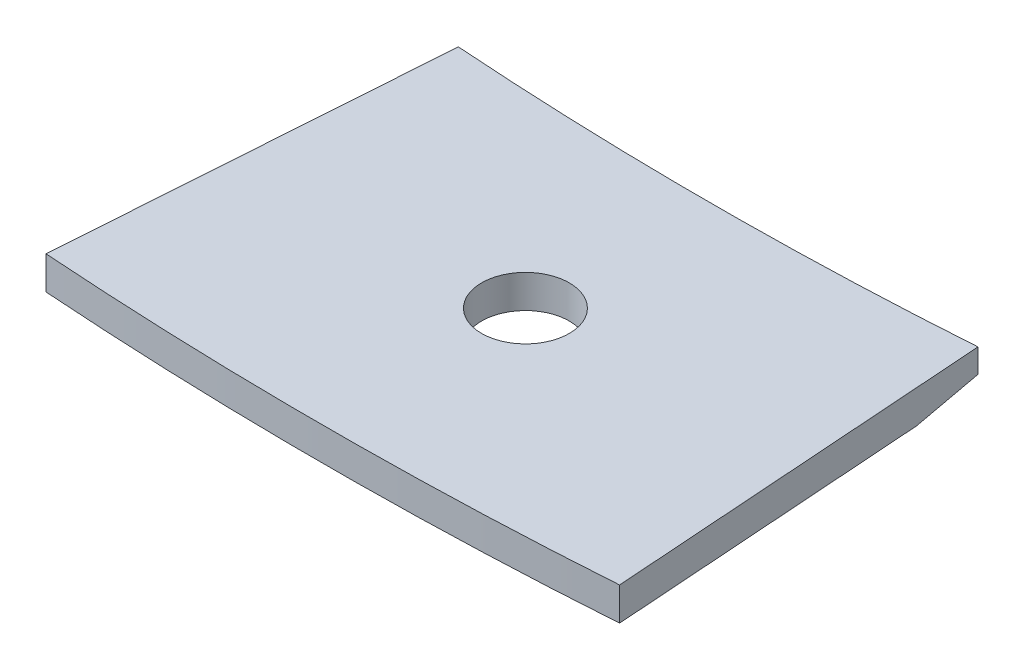
ISO-10303-21;
HEADER;
FILE_DESCRIPTION(('STEP AP214'),'2;1');
FILE_NAME('part.step','',(''),(''),'','','');
FILE_SCHEMA(('AUTOMOTIVE_DESIGN { 1 0 10303 214 1 1 1 1 }'));
ENDSEC;
DATA;
#1=APPLICATION_CONTEXT('core data for automotive mechanical design processes');
#2=APPLICATION_PROTOCOL_DEFINITION('international standard','automotive_design',2000,#1);
#3=PRODUCT_CONTEXT('',#1,'mechanical');
#4=PRODUCT('Part','Part','',(#3));
#5=PRODUCT_RELATED_PRODUCT_CATEGORY('part','',(#4));
#6=PRODUCT_DEFINITION_FORMATION('','',#4);
#7=PRODUCT_DEFINITION_CONTEXT('part definition',#1,'design');
#8=PRODUCT_DEFINITION('design','',#6,#7);
#9=PRODUCT_DEFINITION_SHAPE('','',#8);
#10=(LENGTH_UNIT() NAMED_UNIT(*) SI_UNIT(.MILLI.,.METRE.));
#11=(NAMED_UNIT(*) PLANE_ANGLE_UNIT() SI_UNIT($,.RADIAN.));
#12=(NAMED_UNIT(*) SI_UNIT($,.STERADIAN.) SOLID_ANGLE_UNIT());
#13=UNCERTAINTY_MEASURE_WITH_UNIT(LENGTH_MEASURE(1.E-05),#10,'distance_accuracy_value','');
#14=(GEOMETRIC_REPRESENTATION_CONTEXT(3) GLOBAL_UNCERTAINTY_ASSIGNED_CONTEXT((#13)) GLOBAL_UNIT_ASSIGNED_CONTEXT((#10,
#11,#12)) REPRESENTATION_CONTEXT('',''));
#15=CARTESIAN_POINT('',(0.,0.,0.));
#16=DIRECTION('',(0.,0.,1.));
#17=DIRECTION('',(1.,0.,0.));
#18=AXIS2_PLACEMENT_3D('',#15,#16,#17);
#19=CARTESIAN_POINT('',(1.31838984174237E-13,2.,1.88737914186277E-12));
#20=DIRECTION('',(0.,-1.,0.));
#21=DIRECTION('',(0.,0.,-1.));
#22=AXIS2_PLACEMENT_3D('',#19,#20,#21);
#23=PLANE('',#22);
#24=DIRECTION('',(-0.0697564737443643,0.,-0.997564050259808));
#25=VECTOR('',#24,1.);
#26=CARTESIAN_POINT('',(15.9846959584668,2.,228.591802117044));
#27=LINE('',#26,#25);
#28=CARTESIAN_POINT('',(17.3344837254203,2.,247.894666489571));
#29=VERTEX_POINT('',#28);
#30=CARTESIAN_POINT('',(15.7056700634904,2.,224.601545916004));
#31=VERTEX_POINT('',#30);
#32=EDGE_CURVE('E86',#29,#31,#27,.T.);
#33=ORIENTED_EDGE('',*,*,#32,.T.);
#34=CARTESIAN_POINT('',(0.,2.,0.));
#35=DIRECTION('',(0.,-1.,0.));
#36=DIRECTION('',(0.,0.,-1.));
#37=AXIS2_PLACEMENT_3D('',#34,#35,#36);
#38=CIRCLE('',#37,225.150000000005);
#39=CARTESIAN_POINT('',(-15.7056700634901,2.,224.601545916004));
#40=VERTEX_POINT('',#39);
#41=EDGE_CURVE('E93',#31,#40,#38,.T.);
#42=ORIENTED_EDGE('',*,*,#41,.T.);
#43=DIRECTION('',(-0.069756473743853,0.,0.997564050259843));
#44=VECTOR('',#43,1.);
#45=CARTESIAN_POINT('',(-15.9846959584667,2.,228.591802117044));
#46=LINE('',#45,#44);
#47=CARTESIAN_POINT('',(-17.3344837254102,2.,247.894666489571));
#48=VERTEX_POINT('',#47);
#49=EDGE_CURVE('E115',#40,#48,#46,.T.);
#50=ORIENTED_EDGE('',*,*,#49,.T.);
#51=CARTESIAN_POINT('',(4.63518112781003E-12,2.,0.));
#52=DIRECTION('',(0.,1.,0.));
#53=DIRECTION('',(0.,0.,-1.));
#54=AXIS2_PLACEMENT_3D('',#51,#52,#53);
#55=CIRCLE('',#54,248.500000000005);
#56=EDGE_CURVE('E99',#48,#29,#55,.T.);
#57=ORIENTED_EDGE('',*,*,#56,.T.);
#58=EDGE_LOOP('',(#33,#42,#50,#57));
#59=FACE_BOUND('',#58,.T.);
#60=CARTESIAN_POINT('',(0.,2.,236.25));
#61=DIRECTION('',(0.,1.,0.));
#62=DIRECTION('',(0.,0.,1.));
#63=AXIS2_PLACEMENT_3D('',#60,#61,#62);
#64=CIRCLE('',#63,2.65);
#65=CARTESIAN_POINT('',(0.,2.,238.9));
#66=VERTEX_POINT('',#65);
#67=EDGE_CURVE('E109',#66,#66,#64,.T.);
#68=ORIENTED_EDGE('',*,*,#67,.F.);
#69=EDGE_LOOP('',(#68));
#70=FACE_BOUND('',#69,.T.);
#71=ADVANCED_FACE('F35',(#59,#70),#23,.F.);
#72=CARTESIAN_POINT('',(1.31838984174237E-13,0.,1.88737914186277E-12));
#73=DIRECTION('',(0.,-1.,0.));
#74=DIRECTION('',(0.,0.,-1.));
#75=AXIS2_PLACEMENT_3D('',#72,#73,#74);
#76=PLANE('',#75);
#77=DIRECTION('',(-0.069756473743853,0.,0.997564050259843));
#78=VECTOR('',#77,1.);
#79=CARTESIAN_POINT('',(-15.9846959584667,0.,228.591802117044));
#80=LINE('',#79,#78);
#81=CARTESIAN_POINT('',(-15.9846959584667,0.,228.591802117044));
#82=VERTEX_POINT('',#81);
#83=CARTESIAN_POINT('',(-17.3344837254102,0.,247.894666489571));
#84=VERTEX_POINT('',#83);
#85=EDGE_CURVE('E112',#82,#84,#80,.T.);
#86=ORIENTED_EDGE('',*,*,#85,.F.);
#87=CARTESIAN_POINT('',(0.,0.,0.));
#88=DIRECTION('',(0.,-1.,0.));
#89=DIRECTION('',(0.,0.,-1.));
#90=AXIS2_PLACEMENT_3D('',#87,#88,#89);
#91=CIRCLE('',#90,229.150000000005);
#92=CARTESIAN_POINT('',(15.9846959584668,0.,228.591802117044));
#93=VERTEX_POINT('',#92);
#94=EDGE_CURVE('E44',#82,#93,#91,.F.);
#95=ORIENTED_EDGE('',*,*,#94,.T.);
#96=DIRECTION('',(-0.0697564737443643,0.,-0.997564050259808));
#97=VECTOR('',#96,1.);
#98=CARTESIAN_POINT('',(15.9846959584668,0.,228.591802117044));
#99=LINE('',#98,#97);
#100=CARTESIAN_POINT('',(17.3344837254203,0.,247.894666489571));
#101=VERTEX_POINT('',#100);
#102=EDGE_CURVE('E117',#101,#93,#99,.T.);
#103=ORIENTED_EDGE('',*,*,#102,.F.);
#104=CARTESIAN_POINT('',(4.63518112781003E-12,0.,0.));
#105=DIRECTION('',(0.,1.,0.));
#106=DIRECTION('',(0.,0.,-1.));
#107=AXIS2_PLACEMENT_3D('',#104,#105,#106);
#108=CIRCLE('',#107,248.500000000005);
#109=EDGE_CURVE('E120',#84,#101,#108,.T.);
#110=ORIENTED_EDGE('',*,*,#109,.F.);
#111=EDGE_LOOP('',(#86,#95,#103,#110));
#112=FACE_BOUND('',#111,.T.);
#113=CARTESIAN_POINT('',(0.,0.,236.25));
#114=DIRECTION('',(0.,1.,0.));
#115=DIRECTION('',(0.,0.,1.));
#116=AXIS2_PLACEMENT_3D('',#113,#114,#115);
#117=CIRCLE('',#116,2.65);
#118=CARTESIAN_POINT('',(0.,0.,238.9));
#119=VERTEX_POINT('',#118);
#120=EDGE_CURVE('E107',#119,#119,#117,.T.);
#121=ORIENTED_EDGE('',*,*,#120,.T.);
#122=EDGE_LOOP('',(#121));
#123=FACE_BOUND('',#122,.T.);
#124=ADVANCED_FACE('F135',(#112,#123),#76,.T.);
#125=CARTESIAN_POINT('',(-15.9846959584667,2.,228.591802117044));
#126=DIRECTION('',(0.997564050259843,0.,0.069756473743853));
#127=DIRECTION('',(0.069756473743853,0.,-0.997564050259843));
#128=AXIS2_PLACEMENT_3D('',#125,#126,#127);
#129=PLANE('',#128);
#130=DIRECTION('',(0.,1.,0.));
#131=VECTOR('',#130,1.);
#132=CARTESIAN_POINT('',(-15.7056700634901,0.,224.601545916004));
#133=LINE('',#132,#131);
#134=CARTESIAN_POINT('',(-15.7056700634901,0.562163338809568,224.601545916004));
#135=VERTEX_POINT('',#134);
#136=EDGE_CURVE('E92',#135,#40,#133,.T.);
#137=ORIENTED_EDGE('',*,*,#136,.F.);
#138=DIRECTION('',(-0.0690776085365474,-0.139173100960065,0.987855825496834));
#139=VECTOR('',#138,1.);
#140=CARTESIAN_POINT('',(-6.24017498305519E-11,32.2049322720536,-4.36355542532987E-12));
#141=LINE('',#140,#139);
#142=EDGE_CURVE('E58',#135,#82,#141,.T.);
#143=ORIENTED_EDGE('',*,*,#142,.T.);
#144=ORIENTED_EDGE('',*,*,#85,.T.);
#145=DIRECTION('',(0.,-1.,0.));
#146=VECTOR('',#145,1.);
#147=CARTESIAN_POINT('',(-17.3344837254102,2.,247.894666489571));
#148=LINE('',#147,#146);
#149=EDGE_CURVE('E124',#48,#84,#148,.T.);
#150=ORIENTED_EDGE('',*,*,#149,.F.);
#151=ORIENTED_EDGE('',*,*,#49,.F.);
#152=EDGE_LOOP('',(#137,#143,#144,#150,#151));
#153=FACE_BOUND('',#152,.T.);
#154=ADVANCED_FACE('F130',(#153),#129,.F.);
#155=CARTESIAN_POINT('',(4.63518112781003E-12,2.,0.));
#156=DIRECTION('',(0.,-1.,0.));
#157=DIRECTION('',(0.,0.,-1.));
#158=AXIS2_PLACEMENT_3D('',#155,#156,#157);
#159=CYLINDRICAL_SURFACE('',#158,248.500000000005);
#160=ORIENTED_EDGE('',*,*,#109,.T.);
#161=DIRECTION('',(0.,-1.,0.));
#162=VECTOR('',#161,1.);
#163=CARTESIAN_POINT('',(17.3344837254203,2.,247.894666489571));
#164=LINE('',#163,#162);
#165=EDGE_CURVE('E101',#29,#101,#164,.T.);
#166=ORIENTED_EDGE('',*,*,#165,.F.);
#167=ORIENTED_EDGE('',*,*,#56,.F.);
#168=ORIENTED_EDGE('',*,*,#149,.T.);
#169=EDGE_LOOP('',(#160,#166,#167,#168));
#170=FACE_BOUND('',#169,.T.);
#171=ADVANCED_FACE('F134',(#170),#159,.T.);
#172=CARTESIAN_POINT('',(15.9846959584668,2.,228.591802117044));
#173=DIRECTION('',(-0.997564050259808,0.,0.0697564737443643));
#174=DIRECTION('',(0.0697564737443643,0.,0.997564050259808));
#175=AXIS2_PLACEMENT_3D('',#172,#173,#174);
#176=PLANE('',#175);
#177=ORIENTED_EDGE('',*,*,#102,.T.);
#178=DIRECTION('',(-0.0690776085370537,0.139173100960065,-0.987855825496799));
#179=VECTOR('',#178,1.);
#180=CARTESIAN_POINT('',(-5.46525807861458E-11,32.2049322720536,3.82168073887348E-12));
#181=LINE('',#180,#179);
#182=CARTESIAN_POINT('',(15.7056700634904,0.562163338809568,224.601545916004));
#183=VERTEX_POINT('',#182);
#184=EDGE_CURVE('E11',#93,#183,#181,.T.);
#185=ORIENTED_EDGE('',*,*,#184,.T.);
#186=DIRECTION('',(0.,1.,0.));
#187=VECTOR('',#186,1.);
#188=CARTESIAN_POINT('',(15.7056700634904,0.,224.601545916004));
#189=LINE('',#188,#187);
#190=EDGE_CURVE('E82',#183,#31,#189,.T.);
#191=ORIENTED_EDGE('',*,*,#190,.T.);
#192=ORIENTED_EDGE('',*,*,#32,.F.);
#193=ORIENTED_EDGE('',*,*,#165,.T.);
#194=EDGE_LOOP('',(#177,#185,#191,#192,#193));
#195=FACE_BOUND('',#194,.T.);
#196=ADVANCED_FACE('F84',(#195),#176,.F.);
#197=CARTESIAN_POINT('',(0.,2.,236.25));
#198=DIRECTION('',(0.,-1.,0.));
#199=DIRECTION('',(0.,0.,-1.));
#200=AXIS2_PLACEMENT_3D('',#197,#198,#199);
#201=CYLINDRICAL_SURFACE('',#200,2.65);
#202=ORIENTED_EDGE('',*,*,#67,.T.);
#203=EDGE_LOOP('',(#202));
#204=FACE_BOUND('',#203,.T.);
#205=ORIENTED_EDGE('',*,*,#120,.F.);
#206=EDGE_LOOP('',(#205));
#207=FACE_BOUND('',#206,.T.);
#208=ADVANCED_FACE('F141',(#204,#207),#201,.F.);
#209=CARTESIAN_POINT('',(0.,0.,0.));
#210=DIRECTION('',(0.,1.,0.));
#211=DIRECTION('',(0.,0.,1.));
#212=AXIS2_PLACEMENT_3D('',#209,#210,#211);
#213=CYLINDRICAL_SURFACE('',#212,225.150000000005);
#214=ORIENTED_EDGE('',*,*,#190,.F.);
#215=CARTESIAN_POINT('',(0.,0.562163338809568,0.));
#216=DIRECTION('',(0.,-1.,0.));
#217=DIRECTION('',(0.,0.,-1.));
#218=AXIS2_PLACEMENT_3D('',#215,#216,#217);
#219=CIRCLE('',#218,225.150000000005);
#220=EDGE_CURVE('E127',#183,#135,#219,.T.);
#221=ORIENTED_EDGE('',*,*,#220,.T.);
#222=ORIENTED_EDGE('',*,*,#136,.T.);
#223=ORIENTED_EDGE('',*,*,#41,.F.);
#224=EDGE_LOOP('',(#214,#221,#222,#223));
#225=FACE_BOUND('',#224,.T.);
#226=ADVANCED_FACE('F103',(#225),#213,.F.);
#227=CARTESIAN_POINT('',(0.,0.562163338809568,0.));
#228=DIRECTION('',(0.,-1.,0.));
#229=DIRECTION('',(0.,0.,-1.));
#230=AXIS2_PLACEMENT_3D('',#227,#228,#229);
#231=CONICAL_SURFACE('',#230,225.150000000005,1.43116998663535);
#232=ORIENTED_EDGE('',*,*,#184,.F.);
#233=ORIENTED_EDGE('',*,*,#94,.F.);
#234=ORIENTED_EDGE('',*,*,#142,.F.);
#235=ORIENTED_EDGE('',*,*,#220,.F.);
#236=EDGE_LOOP('',(#232,#233,#234,#235));
#237=FACE_BOUND('',#236,.T.);
#238=ADVANCED_FACE('F38',(#237),#231,.F.);
#239=CLOSED_SHELL('',(#71,#124,#154,#171,#196,#208,#226,#238));
#240=MANIFOLD_SOLID_BREP('B2',#239);
#241=ADVANCED_BREP_SHAPE_REPRESENTATION('',(#18,#240),#14);
#242=SHAPE_DEFINITION_REPRESENTATION(#9,#241);
ENDSEC;
END-ISO-10303-21;
